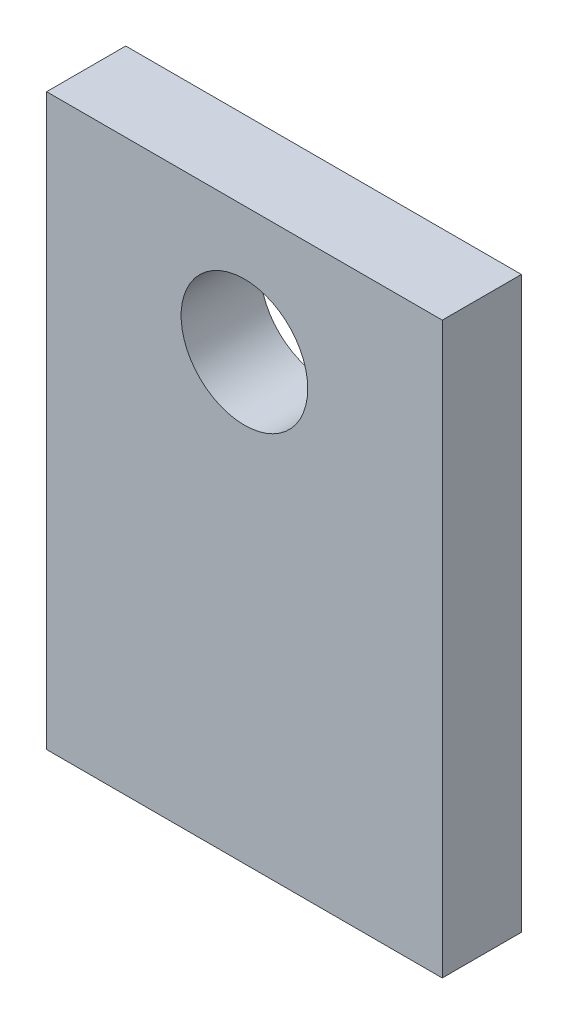
ISO-10303-21;
HEADER;
FILE_DESCRIPTION(('STEP AP214'),'2;1');
FILE_NAME('part.step','',(''),(''),'','','');
FILE_SCHEMA(('AUTOMOTIVE_DESIGN { 1 0 10303 214 1 1 1 1 }'));
ENDSEC;
DATA;
#1=APPLICATION_CONTEXT('core data for automotive mechanical design processes');
#2=APPLICATION_PROTOCOL_DEFINITION('international standard','automotive_design',2000,#1);
#3=PRODUCT_CONTEXT('',#1,'mechanical');
#4=PRODUCT('Part','Part','',(#3));
#5=PRODUCT_RELATED_PRODUCT_CATEGORY('part','',(#4));
#6=PRODUCT_DEFINITION_FORMATION('','',#4);
#7=PRODUCT_DEFINITION_CONTEXT('part definition',#1,'design');
#8=PRODUCT_DEFINITION('design','',#6,#7);
#9=PRODUCT_DEFINITION_SHAPE('','',#8);
#10=(LENGTH_UNIT() NAMED_UNIT(*) SI_UNIT(.MILLI.,.METRE.));
#11=(NAMED_UNIT(*) PLANE_ANGLE_UNIT() SI_UNIT($,.RADIAN.));
#12=(NAMED_UNIT(*) SI_UNIT($,.STERADIAN.) SOLID_ANGLE_UNIT());
#13=UNCERTAINTY_MEASURE_WITH_UNIT(LENGTH_MEASURE(1.E-05),#10,'distance_accuracy_value','');
#14=(GEOMETRIC_REPRESENTATION_CONTEXT(3) GLOBAL_UNCERTAINTY_ASSIGNED_CONTEXT((#13)) GLOBAL_UNIT_ASSIGNED_CONTEXT((#10,
#11,#12)) REPRESENTATION_CONTEXT('',''));
#15=CARTESIAN_POINT('',(0.,0.,0.));
#16=DIRECTION('',(0.,0.,1.));
#17=DIRECTION('',(1.,0.,0.));
#18=AXIS2_PLACEMENT_3D('',#15,#16,#17);
#19=CARTESIAN_POINT('',(0.,180.,25.));
#20=DIRECTION('',(0.,0.,-1.));
#21=DIRECTION('',(-1.,0.,0.));
#22=AXIS2_PLACEMENT_3D('',#19,#20,#21);
#23=PLANE('',#22);
#24=DIRECTION('',(0.,-1.,0.));
#25=VECTOR('',#24,1.);
#26=CARTESIAN_POINT('',(0.,0.,25.));
#27=LINE('',#26,#25);
#28=CARTESIAN_POINT('',(0.,180.,25.));
#29=VERTEX_POINT('',#28);
#30=CARTESIAN_POINT('',(0.,0.,25.));
#31=VERTEX_POINT('',#30);
#32=EDGE_CURVE('E85',#29,#31,#27,.T.);
#33=ORIENTED_EDGE('',*,*,#32,.T.);
#34=DIRECTION('',(1.,0.,0.));
#35=VECTOR('',#34,1.);
#36=CARTESIAN_POINT('',(0.,0.,25.));
#37=LINE('',#36,#35);
#38=CARTESIAN_POINT('',(125.,0.,25.));
#39=VERTEX_POINT('',#38);
#40=EDGE_CURVE('E80',#31,#39,#37,.T.);
#41=ORIENTED_EDGE('',*,*,#40,.T.);
#42=DIRECTION('',(0.,1.,0.));
#43=VECTOR('',#42,1.);
#44=CARTESIAN_POINT('',(125.,0.,25.));
#45=LINE('',#44,#43);
#46=CARTESIAN_POINT('',(125.,180.,25.));
#47=VERTEX_POINT('',#46);
#48=EDGE_CURVE('E83',#39,#47,#45,.T.);
#49=ORIENTED_EDGE('',*,*,#48,.T.);
#50=DIRECTION('',(-1.,0.,0.));
#51=VECTOR('',#50,1.);
#52=CARTESIAN_POINT('',(0.,180.,25.));
#53=LINE('',#52,#51);
#54=EDGE_CURVE('E50',#47,#29,#53,.T.);
#55=ORIENTED_EDGE('',*,*,#54,.T.);
#56=EDGE_LOOP('',(#33,#41,#49,#55));
#57=FACE_BOUND('',#56,.T.);
#58=CARTESIAN_POINT('',(62.5,140.,25.));
#59=DIRECTION('',(0.,0.,1.));
#60=DIRECTION('',(1.,0.,0.));
#61=AXIS2_PLACEMENT_3D('',#58,#59,#60);
#62=CIRCLE('',#61,20.);
#63=CARTESIAN_POINT('',(82.5,140.,25.));
#64=VERTEX_POINT('',#63);
#65=EDGE_CURVE('E100',#64,#64,#62,.T.);
#66=ORIENTED_EDGE('',*,*,#65,.F.);
#67=EDGE_LOOP('',(#66));
#68=FACE_BOUND('',#67,.T.);
#69=ADVANCED_FACE('F33',(#57,#68),#23,.F.);
#70=CARTESIAN_POINT('',(0.,180.,0.));
#71=DIRECTION('',(0.,0.,-1.));
#72=DIRECTION('',(-1.,0.,0.));
#73=AXIS2_PLACEMENT_3D('',#70,#71,#72);
#74=PLANE('',#73);
#75=DIRECTION('',(0.,-1.,0.));
#76=VECTOR('',#75,1.);
#77=CARTESIAN_POINT('',(0.,0.,0.));
#78=LINE('',#77,#76);
#79=CARTESIAN_POINT('',(0.,180.,0.));
#80=VERTEX_POINT('',#79);
#81=CARTESIAN_POINT('',(0.,0.,0.));
#82=VERTEX_POINT('',#81);
#83=EDGE_CURVE('E97',#80,#82,#78,.T.);
#84=ORIENTED_EDGE('',*,*,#83,.F.);
#85=DIRECTION('',(-1.,0.,0.));
#86=VECTOR('',#85,1.);
#87=CARTESIAN_POINT('',(0.,180.,0.));
#88=LINE('',#87,#86);
#89=CARTESIAN_POINT('',(125.,180.,0.));
#90=VERTEX_POINT('',#89);
#91=EDGE_CURVE('E73',#90,#80,#88,.T.);
#92=ORIENTED_EDGE('',*,*,#91,.F.);
#93=DIRECTION('',(0.,1.,0.));
#94=VECTOR('',#93,1.);
#95=CARTESIAN_POINT('',(125.,0.,0.));
#96=LINE('',#95,#94);
#97=CARTESIAN_POINT('',(125.,0.,0.));
#98=VERTEX_POINT('',#97);
#99=EDGE_CURVE('E67',#98,#90,#96,.T.);
#100=ORIENTED_EDGE('',*,*,#99,.F.);
#101=DIRECTION('',(1.,0.,0.));
#102=VECTOR('',#101,1.);
#103=CARTESIAN_POINT('',(0.,0.,0.));
#104=LINE('',#103,#102);
#105=EDGE_CURVE('E89',#82,#98,#104,.T.);
#106=ORIENTED_EDGE('',*,*,#105,.F.);
#107=EDGE_LOOP('',(#84,#92,#100,#106));
#108=FACE_BOUND('',#107,.T.);
#109=CARTESIAN_POINT('',(62.5,140.,0.));
#110=DIRECTION('',(0.,0.,1.));
#111=DIRECTION('',(1.,0.,0.));
#112=AXIS2_PLACEMENT_3D('',#109,#110,#111);
#113=CIRCLE('',#112,20.);
#114=CARTESIAN_POINT('',(82.5,140.,0.));
#115=VERTEX_POINT('',#114);
#116=EDGE_CURVE('E112',#115,#115,#113,.T.);
#117=ORIENTED_EDGE('',*,*,#116,.T.);
#118=EDGE_LOOP('',(#117));
#119=FACE_BOUND('',#118,.T.);
#120=ADVANCED_FACE('F108',(#108,#119),#74,.T.);
#121=CARTESIAN_POINT('',(0.,0.,25.));
#122=DIRECTION('',(1.,0.,0.));
#123=DIRECTION('',(0.,0.,-1.));
#124=AXIS2_PLACEMENT_3D('',#121,#122,#123);
#125=PLANE('',#124);
#126=ORIENTED_EDGE('',*,*,#83,.T.);
#127=DIRECTION('',(0.,0.,-1.));
#128=VECTOR('',#127,1.);
#129=CARTESIAN_POINT('',(0.,0.,25.));
#130=LINE('',#129,#128);
#131=EDGE_CURVE('E11',#31,#82,#130,.T.);
#132=ORIENTED_EDGE('',*,*,#131,.F.);
#133=ORIENTED_EDGE('',*,*,#32,.F.);
#134=DIRECTION('',(0.,0.,-1.));
#135=VECTOR('',#134,1.);
#136=CARTESIAN_POINT('',(0.,180.,25.));
#137=LINE('',#136,#135);
#138=EDGE_CURVE('E93',#29,#80,#137,.T.);
#139=ORIENTED_EDGE('',*,*,#138,.T.);
#140=EDGE_LOOP('',(#126,#132,#133,#139));
#141=FACE_BOUND('',#140,.T.);
#142=ADVANCED_FACE('F35',(#141),#125,.F.);
#143=CARTESIAN_POINT('',(0.,0.,25.));
#144=DIRECTION('',(0.,1.,0.));
#145=DIRECTION('',(0.,0.,1.));
#146=AXIS2_PLACEMENT_3D('',#143,#144,#145);
#147=PLANE('',#146);
#148=ORIENTED_EDGE('',*,*,#105,.T.);
#149=DIRECTION('',(0.,0.,-1.));
#150=VECTOR('',#149,1.);
#151=CARTESIAN_POINT('',(125.,0.,25.));
#152=LINE('',#151,#150);
#153=EDGE_CURVE('E42',#39,#98,#152,.T.);
#154=ORIENTED_EDGE('',*,*,#153,.F.);
#155=ORIENTED_EDGE('',*,*,#40,.F.);
#156=ORIENTED_EDGE('',*,*,#131,.T.);
#157=EDGE_LOOP('',(#148,#154,#155,#156));
#158=FACE_BOUND('',#157,.T.);
#159=ADVANCED_FACE('F88',(#158),#147,.F.);
#160=CARTESIAN_POINT('',(125.,0.,25.));
#161=DIRECTION('',(-1.,0.,0.));
#162=DIRECTION('',(0.,0.,1.));
#163=AXIS2_PLACEMENT_3D('',#160,#161,#162);
#164=PLANE('',#163);
#165=ORIENTED_EDGE('',*,*,#99,.T.);
#166=DIRECTION('',(0.,0.,-1.));
#167=VECTOR('',#166,1.);
#168=CARTESIAN_POINT('',(125.,180.,25.));
#169=LINE('',#168,#167);
#170=EDGE_CURVE('E90',#47,#90,#169,.T.);
#171=ORIENTED_EDGE('',*,*,#170,.F.);
#172=ORIENTED_EDGE('',*,*,#48,.F.);
#173=ORIENTED_EDGE('',*,*,#153,.T.);
#174=EDGE_LOOP('',(#165,#171,#172,#173));
#175=FACE_BOUND('',#174,.T.);
#176=ADVANCED_FACE('F91',(#175),#164,.F.);
#177=CARTESIAN_POINT('',(0.,180.,25.));
#178=DIRECTION('',(0.,-1.,0.));
#179=DIRECTION('',(0.,0.,-1.));
#180=AXIS2_PLACEMENT_3D('',#177,#178,#179);
#181=PLANE('',#180);
#182=ORIENTED_EDGE('',*,*,#91,.T.);
#183=ORIENTED_EDGE('',*,*,#138,.F.);
#184=ORIENTED_EDGE('',*,*,#54,.F.);
#185=ORIENTED_EDGE('',*,*,#170,.T.);
#186=EDGE_LOOP('',(#182,#183,#184,#185));
#187=FACE_BOUND('',#186,.T.);
#188=ADVANCED_FACE('F105',(#187),#181,.F.);
#189=CARTESIAN_POINT('',(62.5,140.,25.));
#190=DIRECTION('',(0.,0.,-1.));
#191=DIRECTION('',(-1.,0.,0.));
#192=AXIS2_PLACEMENT_3D('',#189,#190,#191);
#193=CYLINDRICAL_SURFACE('',#192,20.);
#194=ORIENTED_EDGE('',*,*,#65,.T.);
#195=EDGE_LOOP('',(#194));
#196=FACE_BOUND('',#195,.T.);
#197=ORIENTED_EDGE('',*,*,#116,.F.);
#198=EDGE_LOOP('',(#197));
#199=FACE_BOUND('',#198,.T.);
#200=ADVANCED_FACE('F118',(#196,#199),#193,.F.);
#201=CLOSED_SHELL('',(#69,#120,#142,#159,#176,#188,#200));
#202=MANIFOLD_SOLID_BREP('B2',#201);
#203=ADVANCED_BREP_SHAPE_REPRESENTATION('',(#18,#202),#14);
#204=SHAPE_DEFINITION_REPRESENTATION(#9,#203);
ENDSEC;
END-ISO-10303-21;
